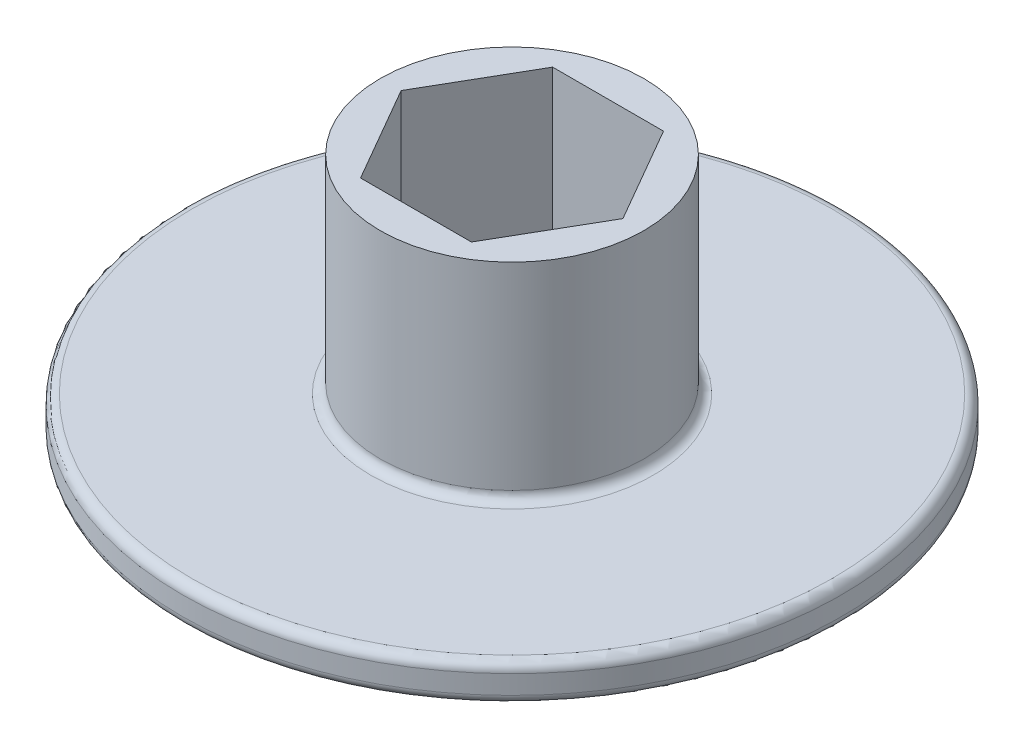
ISO-10303-21;
HEADER;
FILE_DESCRIPTION(('STEP AP214'),'2;1');
FILE_NAME('part.step','',(''),(''),'','','');
FILE_SCHEMA(('AUTOMOTIVE_DESIGN { 1 0 10303 214 1 1 1 1 }'));
ENDSEC;
DATA;
#1=APPLICATION_CONTEXT('core data for automotive mechanical design processes');
#2=APPLICATION_PROTOCOL_DEFINITION('international standard','automotive_design',2000,#1);
#3=PRODUCT_CONTEXT('',#1,'mechanical');
#4=PRODUCT('Part','Part','',(#3));
#5=PRODUCT_RELATED_PRODUCT_CATEGORY('part','',(#4));
#6=PRODUCT_DEFINITION_FORMATION('','',#4);
#7=PRODUCT_DEFINITION_CONTEXT('part definition',#1,'design');
#8=PRODUCT_DEFINITION('design','',#6,#7);
#9=PRODUCT_DEFINITION_SHAPE('','',#8);
#10=(LENGTH_UNIT() NAMED_UNIT(*) SI_UNIT(.MILLI.,.METRE.));
#11=(NAMED_UNIT(*) PLANE_ANGLE_UNIT() SI_UNIT($,.RADIAN.));
#12=(NAMED_UNIT(*) SI_UNIT($,.STERADIAN.) SOLID_ANGLE_UNIT());
#13=UNCERTAINTY_MEASURE_WITH_UNIT(LENGTH_MEASURE(1.E-05),#10,'distance_accuracy_value','');
#14=(GEOMETRIC_REPRESENTATION_CONTEXT(3) GLOBAL_UNCERTAINTY_ASSIGNED_CONTEXT((#13)) GLOBAL_UNIT_ASSIGNED_CONTEXT((#10,
#11,#12)) REPRESENTATION_CONTEXT('',''));
#15=CARTESIAN_POINT('',(0.,0.,0.));
#16=DIRECTION('',(0.,0.,1.));
#17=DIRECTION('',(1.,0.,0.));
#18=AXIS2_PLACEMENT_3D('',#15,#16,#17);
#19=CARTESIAN_POINT('',(0.,2.54,0.));
#20=DIRECTION('',(0.,1.,0.));
#21=DIRECTION('',(0.,0.,1.));
#22=AXIS2_PLACEMENT_3D('',#19,#20,#21);
#23=PLANE('',#22);
#24=CARTESIAN_POINT('',(0.,2.54,0.));
#25=DIRECTION('',(0.,1.,0.));
#26=DIRECTION('',(0.,0.,1.));
#27=AXIS2_PLACEMENT_3D('',#24,#25,#26);
#28=CIRCLE('',#27,9.525);
#29=CARTESIAN_POINT('',(0.,2.54,9.525));
#30=VERTEX_POINT('',#29);
#31=EDGE_CURVE('E180',#30,#30,#28,.F.);
#32=ORIENTED_EDGE('',*,*,#31,.T.);
#33=EDGE_LOOP('',(#32));
#34=FACE_BOUND('',#33,.T.);
#35=CARTESIAN_POINT('',(0.,2.54,0.));
#36=DIRECTION('',(0.,1.,0.));
#37=DIRECTION('',(0.,0.,1.));
#38=AXIS2_PLACEMENT_3D('',#35,#36,#37);
#39=CIRCLE('',#38,21.59);
#40=CARTESIAN_POINT('',(0.,2.54,21.59));
#41=VERTEX_POINT('',#40);
#42=EDGE_CURVE('E176',#41,#41,#39,.T.);
#43=ORIENTED_EDGE('',*,*,#42,.T.);
#44=EDGE_LOOP('',(#43));
#45=FACE_BOUND('',#44,.T.);
#46=ADVANCED_FACE('F42',(#34,#45),#23,.T.);
#47=CARTESIAN_POINT('',(0.,0.,0.));
#48=DIRECTION('',(0.,1.,0.));
#49=DIRECTION('',(0.,0.,1.));
#50=AXIS2_PLACEMENT_3D('',#47,#48,#49);
#51=PLANE('',#50);
#52=DIRECTION('',(0.500000000000007,0.,0.866025403784435));
#53=VECTOR('',#52,1.);
#54=CARTESIAN_POINT('',(-4.28942382494426,0.,6.79450000000004));
#55=LINE('',#54,#53);
#56=CARTESIAN_POINT('',(-8.21223022895324,0.,0.));
#57=VERTEX_POINT('',#56);
#58=CARTESIAN_POINT('',(-4.10611511447655,0.,7.11200000000004));
#59=VERTEX_POINT('',#58);
#60=EDGE_CURVE('E208',#57,#59,#55,.T.);
#61=ORIENTED_EDGE('',*,*,#60,.T.);
#62=DIRECTION('',(1.,0.,0.));
#63=VECTOR('',#62,1.);
#64=CARTESIAN_POINT('',(3.73949769354129,0.,7.11199999999996));
#65=LINE('',#64,#63);
#66=CARTESIAN_POINT('',(4.1061151144767,0.,7.11199999999996));
#67=VERTEX_POINT('',#66);
#68=EDGE_CURVE('E211',#59,#67,#65,.T.);
#69=ORIENTED_EDGE('',*,*,#68,.T.);
#70=DIRECTION('',(0.499999999999995,0.,-0.866025403784442));
#71=VECTOR('',#70,1.);
#72=CARTESIAN_POINT('',(8.02892151848554,0.,0.317499999999996));
#73=LINE('',#72,#71);
#74=CARTESIAN_POINT('',(8.21223022895324,0.,0.));
#75=VERTEX_POINT('',#74);
#76=EDGE_CURVE('E196',#67,#75,#73,.T.);
#77=ORIENTED_EDGE('',*,*,#76,.T.);
#78=DIRECTION('',(-0.500000000000001,0.,-0.866025403784438));
#79=VECTOR('',#78,1.);
#80=CARTESIAN_POINT('',(4.28942382494431,0.,-6.79450000000002));
#81=LINE('',#80,#79);
#82=CARTESIAN_POINT('',(4.10611511447661,0.,-7.11200000000002));
#83=VERTEX_POINT('',#82);
#84=EDGE_CURVE('E199',#75,#83,#81,.T.);
#85=ORIENTED_EDGE('',*,*,#84,.T.);
#86=DIRECTION('',(-1.,0.,0.));
#87=VECTOR('',#86,1.);
#88=CARTESIAN_POINT('',(-3.73949769354124,0.,-7.11199999999999));
#89=LINE('',#88,#87);
#90=CARTESIAN_POINT('',(-4.10611511447665,0.,-7.11199999999999));
#91=VERTEX_POINT('',#90);
#92=EDGE_CURVE('E202',#83,#91,#89,.T.);
#93=ORIENTED_EDGE('',*,*,#92,.T.);
#94=DIRECTION('',(-0.499999999999995,0.,0.866025403784442));
#95=VECTOR('',#94,1.);
#96=CARTESIAN_POINT('',(-8.02892151848554,0.,-0.317499999999944));
#97=LINE('',#96,#95);
#98=EDGE_CURVE('E205',#91,#57,#97,.T.);
#99=ORIENTED_EDGE('',*,*,#98,.T.);
#100=EDGE_LOOP('',(#61,#69,#77,#85,#93,#99));
#101=FACE_BOUND('',#100,.T.);
#102=CARTESIAN_POINT('',(0.,0.,0.));
#103=DIRECTION('',(0.,1.,0.));
#104=DIRECTION('',(0.,0.,1.));
#105=AXIS2_PLACEMENT_3D('',#102,#103,#104);
#106=CIRCLE('',#105,21.59);
#107=CARTESIAN_POINT('',(0.,0.,21.59));
#108=VERTEX_POINT('',#107);
#109=EDGE_CURVE('E192',#108,#108,#106,.F.);
#110=ORIENTED_EDGE('',*,*,#109,.T.);
#111=EDGE_LOOP('',(#110));
#112=FACE_BOUND('',#111,.T.);
#113=ADVANCED_FACE('F292',(#101,#112),#51,.F.);
#114=CARTESIAN_POINT('',(0.,2.54,0.));
#115=DIRECTION('',(0.,-1.,0.));
#116=DIRECTION('',(0.,0.,-1.));
#117=AXIS2_PLACEMENT_3D('',#114,#115,#116);
#118=CYLINDRICAL_SURFACE('',#117,22.225);
#119=CARTESIAN_POINT('',(0.,1.905,0.));
#120=DIRECTION('',(0.,1.,0.));
#121=DIRECTION('',(0.,0.,1.));
#122=AXIS2_PLACEMENT_3D('',#119,#120,#121);
#123=CIRCLE('',#122,22.225);
#124=CARTESIAN_POINT('',(0.,1.905,22.225));
#125=VERTEX_POINT('',#124);
#126=EDGE_CURVE('E188',#125,#125,#123,.F.);
#127=ORIENTED_EDGE('',*,*,#126,.T.);
#128=EDGE_LOOP('',(#127));
#129=FACE_BOUND('',#128,.T.);
#130=CARTESIAN_POINT('',(0.,0.635,0.));
#131=DIRECTION('',(0.,1.,0.));
#132=DIRECTION('',(0.,0.,1.));
#133=AXIS2_PLACEMENT_3D('',#130,#131,#132);
#134=CIRCLE('',#133,22.225);
#135=CARTESIAN_POINT('',(0.,0.635,22.225));
#136=VERTEX_POINT('',#135);
#137=EDGE_CURVE('E184',#136,#136,#134,.T.);
#138=ORIENTED_EDGE('',*,*,#137,.T.);
#139=EDGE_LOOP('',(#138));
#140=FACE_BOUND('',#139,.T.);
#141=ADVANCED_FACE('F298',(#129,#140),#118,.T.);
#142=CARTESIAN_POINT('',(3.73949769354128,2.54,6.47699999999996));
#143=DIRECTION('',(-0.866025403784442,0.,-0.499999999999995));
#144=DIRECTION('',(-0.499999999999995,0.,0.866025403784442));
#145=AXIS2_PLACEMENT_3D('',#142,#143,#144);
#146=PLANE('',#145);
#147=DIRECTION('',(0.,-1.,0.));
#148=VECTOR('',#147,1.);
#149=CARTESIAN_POINT('',(7.47899538708242,2.54,0.));
#150=LINE('',#149,#148);
#151=CARTESIAN_POINT('',(7.47899538708242,16.51,-1.04083408558608E-13));
#152=VERTEX_POINT('',#151);
#153=CARTESIAN_POINT('',(7.47899538708242,0.635,0.));
#154=VERTEX_POINT('',#153);
#155=EDGE_CURVE('E121',#152,#154,#150,.T.);
#156=ORIENTED_EDGE('',*,*,#155,.T.);
#157=DIRECTION('',(0.499999999999995,0.,-0.866025403784442));
#158=VECTOR('',#157,1.);
#159=CARTESIAN_POINT('',(3.73949769354128,0.635,6.47699999999996));
#160=LINE('',#159,#158);
#161=CARTESIAN_POINT('',(3.73949769354128,0.635,6.47699999999996));
#162=VERTEX_POINT('',#161);
#163=EDGE_CURVE('E11',#154,#162,#160,.F.);
#164=ORIENTED_EDGE('',*,*,#163,.T.);
#165=DIRECTION('',(0.,-1.,0.));
#166=VECTOR('',#165,1.);
#167=CARTESIAN_POINT('',(3.73949769354128,2.54,6.47699999999996));
#168=LINE('',#167,#166);
#169=CARTESIAN_POINT('',(3.73949769354128,16.51,6.47699999999996));
#170=VERTEX_POINT('',#169);
#171=EDGE_CURVE('E156',#170,#162,#168,.T.);
#172=ORIENTED_EDGE('',*,*,#171,.F.);
#173=DIRECTION('',(0.499999999999989,0.,-0.866025403784445));
#174=VECTOR('',#173,1.);
#175=CARTESIAN_POINT('',(3.73949769354128,16.51,6.47699999999996));
#176=LINE('',#175,#174);
#177=EDGE_CURVE('E149',#170,#152,#176,.T.);
#178=ORIENTED_EDGE('',*,*,#177,.T.);
#179=EDGE_LOOP('',(#156,#164,#172,#178));
#180=FACE_BOUND('',#179,.T.);
#181=ADVANCED_FACE('F266',(#180),#146,.T.);
#182=CARTESIAN_POINT('',(7.47899538708242,2.54,0.));
#183=DIRECTION('',(-0.866025403784438,0.,0.500000000000001));
#184=DIRECTION('',(0.500000000000001,0.,0.866025403784438));
#185=AXIS2_PLACEMENT_3D('',#182,#183,#184);
#186=PLANE('',#185);
#187=DIRECTION('',(0.,-1.,0.));
#188=VECTOR('',#187,1.);
#189=CARTESIAN_POINT('',(3.73949769354119,2.54,-6.47700000000001));
#190=LINE('',#189,#188);
#191=CARTESIAN_POINT('',(3.73949769354119,16.51,-6.47700000000001));
#192=VERTEX_POINT('',#191);
#193=CARTESIAN_POINT('',(3.73949769354119,0.635,-6.47700000000001));
#194=VERTEX_POINT('',#193);
#195=EDGE_CURVE('E113',#192,#194,#190,.T.);
#196=ORIENTED_EDGE('',*,*,#195,.T.);
#197=DIRECTION('',(-0.500000000000001,0.,-0.866025403784438));
#198=VECTOR('',#197,1.);
#199=CARTESIAN_POINT('',(7.47899538708242,0.635,0.));
#200=LINE('',#199,#198);
#201=EDGE_CURVE('E52',#194,#154,#200,.F.);
#202=ORIENTED_EDGE('',*,*,#201,.T.);
#203=ORIENTED_EDGE('',*,*,#155,.F.);
#204=DIRECTION('',(-0.500000000000007,0.,-0.866025403784434));
#205=VECTOR('',#204,1.);
#206=CARTESIAN_POINT('',(7.47899538708242,16.51,-1.04083408558608E-13));
#207=LINE('',#206,#205);
#208=EDGE_CURVE('E125',#152,#192,#207,.T.);
#209=ORIENTED_EDGE('',*,*,#208,.T.);
#210=EDGE_LOOP('',(#196,#202,#203,#209));
#211=FACE_BOUND('',#210,.T.);
#212=ADVANCED_FACE('F126',(#211),#186,.T.);
#213=CARTESIAN_POINT('',(3.73949769354119,2.54,-6.47700000000001));
#214=DIRECTION('',(0.,0.,1.));
#215=DIRECTION('',(1.,0.,0.));
#216=AXIS2_PLACEMENT_3D('',#213,#214,#215);
#217=PLANE('',#216);
#218=DIRECTION('',(0.,-1.,0.));
#219=VECTOR('',#218,1.);
#220=CARTESIAN_POINT('',(-3.73949769354124,2.54,-6.47699999999999));
#221=LINE('',#220,#219);
#222=CARTESIAN_POINT('',(-3.73949769354124,16.51,-6.47699999999999));
#223=VERTEX_POINT('',#222);
#224=CARTESIAN_POINT('',(-3.73949769354124,0.635,-6.47699999999999));
#225=VERTEX_POINT('',#224);
#226=EDGE_CURVE('E122',#223,#225,#221,.T.);
#227=ORIENTED_EDGE('',*,*,#226,.T.);
#228=DIRECTION('',(-1.,0.,0.));
#229=VECTOR('',#228,1.);
#230=CARTESIAN_POINT('',(3.73949769354119,0.635,-6.47700000000001));
#231=LINE('',#230,#229);
#232=EDGE_CURVE('E67',#225,#194,#231,.F.);
#233=ORIENTED_EDGE('',*,*,#232,.T.);
#234=ORIENTED_EDGE('',*,*,#195,.F.);
#235=DIRECTION('',(-1.,0.,0.));
#236=VECTOR('',#235,1.);
#237=CARTESIAN_POINT('',(3.73949769354119,16.51,-6.47700000000001));
#238=LINE('',#237,#236);
#239=EDGE_CURVE('E117',#192,#223,#238,.T.);
#240=ORIENTED_EDGE('',*,*,#239,.T.);
#241=EDGE_LOOP('',(#227,#233,#234,#240));
#242=FACE_BOUND('',#241,.T.);
#243=ADVANCED_FACE('F115',(#242),#217,.T.);
#244=CARTESIAN_POINT('',(-3.73949769354124,2.54,-6.47699999999999));
#245=DIRECTION('',(0.866025403784441,0.,0.499999999999995));
#246=DIRECTION('',(0.499999999999995,0.,-0.866025403784442));
#247=AXIS2_PLACEMENT_3D('',#244,#245,#246);
#248=PLANE('',#247);
#249=DIRECTION('',(0.,-1.,0.));
#250=VECTOR('',#249,1.);
#251=CARTESIAN_POINT('',(-7.47899538708242,2.54,0.));
#252=LINE('',#251,#250);
#253=CARTESIAN_POINT('',(-7.47899538708242,16.51,0.));
#254=VERTEX_POINT('',#253);
#255=CARTESIAN_POINT('',(-7.47899538708242,0.635,0.));
#256=VERTEX_POINT('',#255);
#257=EDGE_CURVE('E164',#254,#256,#252,.T.);
#258=ORIENTED_EDGE('',*,*,#257,.T.);
#259=DIRECTION('',(-0.499999999999995,0.,0.866025403784442));
#260=VECTOR('',#259,1.);
#261=CARTESIAN_POINT('',(-3.73949769354124,0.635,-6.47699999999999));
#262=LINE('',#261,#260);
#263=EDGE_CURVE('E222',#256,#225,#262,.F.);
#264=ORIENTED_EDGE('',*,*,#263,.T.);
#265=ORIENTED_EDGE('',*,*,#226,.F.);
#266=DIRECTION('',(-0.499999999999995,0.,0.866025403784441));
#267=VECTOR('',#266,1.);
#268=CARTESIAN_POINT('',(-3.73949769354124,16.51,-6.47699999999999));
#269=LINE('',#268,#267);
#270=EDGE_CURVE('E135',#223,#254,#269,.T.);
#271=ORIENTED_EDGE('',*,*,#270,.T.);
#272=EDGE_LOOP('',(#258,#264,#265,#271));
#273=FACE_BOUND('',#272,.T.);
#274=ADVANCED_FACE('F282',(#273),#248,.T.);
#275=CARTESIAN_POINT('',(-7.47899538708242,2.54,0.));
#276=DIRECTION('',(0.866025403784434,0.,-0.500000000000007));
#277=DIRECTION('',(-0.500000000000007,0.,-0.866025403784435));
#278=AXIS2_PLACEMENT_3D('',#275,#276,#277);
#279=PLANE('',#278);
#280=DIRECTION('',(0.,-1.,0.));
#281=VECTOR('',#280,1.);
#282=CARTESIAN_POINT('',(-3.73949769354115,2.54,6.47700000000004));
#283=LINE('',#282,#281);
#284=CARTESIAN_POINT('',(-3.73949769354115,16.51,6.47700000000004));
#285=VERTEX_POINT('',#284);
#286=CARTESIAN_POINT('',(-3.73949769354115,0.635,6.47700000000004));
#287=VERTEX_POINT('',#286);
#288=EDGE_CURVE('E160',#285,#287,#283,.T.);
#289=ORIENTED_EDGE('',*,*,#288,.T.);
#290=DIRECTION('',(0.500000000000007,0.,0.866025403784435));
#291=VECTOR('',#290,1.);
#292=CARTESIAN_POINT('',(-7.47899538708242,0.635,0.));
#293=LINE('',#292,#291);
#294=EDGE_CURVE('E219',#287,#256,#293,.F.);
#295=ORIENTED_EDGE('',*,*,#294,.T.);
#296=ORIENTED_EDGE('',*,*,#257,.F.);
#297=DIRECTION('',(0.500000000000007,0.,0.866025403784435));
#298=VECTOR('',#297,1.);
#299=CARTESIAN_POINT('',(-7.47899538708242,16.51,0.));
#300=LINE('',#299,#298);
#301=EDGE_CURVE('E139',#254,#285,#300,.T.);
#302=ORIENTED_EDGE('',*,*,#301,.T.);
#303=EDGE_LOOP('',(#289,#295,#296,#302));
#304=FACE_BOUND('',#303,.T.);
#305=ADVANCED_FACE('F280',(#304),#279,.T.);
#306=CARTESIAN_POINT('',(-3.73949769354115,2.54,6.47700000000004));
#307=DIRECTION('',(0.,0.,-1.));
#308=DIRECTION('',(-1.,0.,0.));
#309=AXIS2_PLACEMENT_3D('',#306,#307,#308);
#310=PLANE('',#309);
#311=ORIENTED_EDGE('',*,*,#171,.T.);
#312=DIRECTION('',(1.,0.,0.));
#313=VECTOR('',#312,1.);
#314=CARTESIAN_POINT('',(-3.73949769354115,0.635,6.47700000000004));
#315=LINE('',#314,#313);
#316=EDGE_CURVE('E215',#162,#287,#315,.F.);
#317=ORIENTED_EDGE('',*,*,#316,.T.);
#318=ORIENTED_EDGE('',*,*,#288,.F.);
#319=DIRECTION('',(1.,0.,0.));
#320=VECTOR('',#319,1.);
#321=CARTESIAN_POINT('',(-3.73949769354115,16.51,6.47700000000004));
#322=LINE('',#321,#320);
#323=EDGE_CURVE('E145',#285,#170,#322,.T.);
#324=ORIENTED_EDGE('',*,*,#323,.T.);
#325=EDGE_LOOP('',(#311,#317,#318,#324));
#326=FACE_BOUND('',#325,.T.);
#327=ADVANCED_FACE('F269',(#326),#310,.T.);
#328=CARTESIAN_POINT('',(0.,16.51,0.));
#329=DIRECTION('',(0.,1.,0.));
#330=DIRECTION('',(0.,0.,1.));
#331=AXIS2_PLACEMENT_3D('',#328,#329,#330);
#332=PLANE('',#331);
#333=CARTESIAN_POINT('',(0.,16.51,0.));
#334=DIRECTION('',(0.,1.,0.));
#335=DIRECTION('',(0.,0.,1.));
#336=AXIS2_PLACEMENT_3D('',#333,#334,#335);
#337=CIRCLE('',#336,8.89);
#338=CARTESIAN_POINT('',(0.,16.51,8.89));
#339=VERTEX_POINT('',#338);
#340=EDGE_CURVE('E152',#339,#339,#337,.T.);
#341=ORIENTED_EDGE('',*,*,#340,.T.);
#342=EDGE_LOOP('',(#341));
#343=FACE_BOUND('',#342,.T.);
#344=ORIENTED_EDGE('',*,*,#239,.F.);
#345=ORIENTED_EDGE('',*,*,#208,.F.);
#346=ORIENTED_EDGE('',*,*,#177,.F.);
#347=ORIENTED_EDGE('',*,*,#323,.F.);
#348=ORIENTED_EDGE('',*,*,#301,.F.);
#349=ORIENTED_EDGE('',*,*,#270,.F.);
#350=EDGE_LOOP('',(#344,#345,#346,#347,#348,#349));
#351=FACE_BOUND('',#350,.T.);
#352=ADVANCED_FACE('F132',(#343,#351),#332,.T.);
#353=CARTESIAN_POINT('',(0.,16.51,0.));
#354=DIRECTION('',(0.,-1.,0.));
#355=DIRECTION('',(0.,0.,-1.));
#356=AXIS2_PLACEMENT_3D('',#353,#354,#355);
#357=CYLINDRICAL_SURFACE('',#356,8.89);
#358=CARTESIAN_POINT('',(0.,3.175,0.));
#359=DIRECTION('',(0.,1.,0.));
#360=DIRECTION('',(0.,0.,1.));
#361=AXIS2_PLACEMENT_3D('',#358,#359,#360);
#362=CIRCLE('',#361,8.89);
#363=CARTESIAN_POINT('',(0.,3.175,8.89));
#364=VERTEX_POINT('',#363);
#365=EDGE_CURVE('E172',#364,#364,#362,.T.);
#366=ORIENTED_EDGE('',*,*,#365,.T.);
#367=EDGE_LOOP('',(#366));
#368=FACE_BOUND('',#367,.T.);
#369=ORIENTED_EDGE('',*,*,#340,.F.);
#370=EDGE_LOOP('',(#369));
#371=FACE_BOUND('',#370,.T.);
#372=ADVANCED_FACE('F312',(#368,#371),#357,.T.);
#373=CARTESIAN_POINT('',(0.,3.175,0.));
#374=DIRECTION('',(0.,1.,0.));
#375=DIRECTION('',(0.,0.,1.));
#376=AXIS2_PLACEMENT_3D('',#373,#374,#375);
#377=TOROIDAL_SURFACE('',#376,9.525,0.635);
#378=ORIENTED_EDGE('',*,*,#31,.F.);
#379=EDGE_LOOP('',(#378));
#380=FACE_BOUND('',#379,.T.);
#381=ORIENTED_EDGE('',*,*,#365,.F.);
#382=EDGE_LOOP('',(#381));
#383=FACE_BOUND('',#382,.T.);
#384=ADVANCED_FACE('F308',(#380,#383),#377,.F.);
#385=CARTESIAN_POINT('',(0.,1.905,0.));
#386=DIRECTION('',(0.,1.,0.));
#387=DIRECTION('',(0.,0.,1.));
#388=AXIS2_PLACEMENT_3D('',#385,#386,#387);
#389=TOROIDAL_SURFACE('',#388,21.59,0.635);
#390=ORIENTED_EDGE('',*,*,#126,.F.);
#391=EDGE_LOOP('',(#390));
#392=FACE_BOUND('',#391,.T.);
#393=ORIENTED_EDGE('',*,*,#42,.F.);
#394=EDGE_LOOP('',(#393));
#395=FACE_BOUND('',#394,.T.);
#396=ADVANCED_FACE('F311',(#392,#395),#389,.T.);
#397=CARTESIAN_POINT('',(0.,0.635,-7.112));
#398=DIRECTION('',(1.,0.,0.));
#399=DIRECTION('',(0.,0.,-1.));
#400=AXIS2_PLACEMENT_3D('',#397,#398,#399);
#401=CYLINDRICAL_SURFACE('',#400,0.635);
#402=CARTESIAN_POINT('',(4.10611511447661,0.635,-7.11200000000002));
#403=DIRECTION('',(0.86602540378444,0.,0.499999999999998));
#404=DIRECTION('',(0.499999999999998,0.,-0.86602540378444));
#405=AXIS2_PLACEMENT_3D('',#402,#403,#404);
#406=ELLIPSE('',#405,0.733234841870825,0.635);
#407=EDGE_CURVE('E242',#194,#83,#406,.T.);
#408=ORIENTED_EDGE('',*,*,#407,.F.);
#409=ORIENTED_EDGE('',*,*,#232,.F.);
#410=CARTESIAN_POINT('',(-4.10611511447665,0.635,-7.11199999999999));
#411=DIRECTION('',(0.866025403784436,0.,-0.500000000000004));
#412=DIRECTION('',(-0.500000000000004,0.,-0.866025403784436));
#413=AXIS2_PLACEMENT_3D('',#410,#411,#412);
#414=ELLIPSE('',#413,0.733234841870825,0.635);
#415=EDGE_CURVE('E46',#91,#225,#414,.F.);
#416=ORIENTED_EDGE('',*,*,#415,.F.);
#417=ORIENTED_EDGE('',*,*,#92,.F.);
#418=EDGE_LOOP('',(#408,#409,#416,#417));
#419=FACE_BOUND('',#418,.T.);
#420=ADVANCED_FACE('F257',(#419),#401,.T.);
#421=CARTESIAN_POINT('',(-6.15917267171495,0.635,-3.55599999999996));
#422=DIRECTION('',(0.499999999999995,0.,-0.866025403784442));
#423=DIRECTION('',(-0.866025403784441,0.,-0.499999999999995));
#424=AXIS2_PLACEMENT_3D('',#421,#422,#423);
#425=CYLINDRICAL_SURFACE('',#424,0.635);
#426=ORIENTED_EDGE('',*,*,#415,.T.);
#427=ORIENTED_EDGE('',*,*,#263,.F.);
#428=CARTESIAN_POINT('',(-8.21223022895324,0.635,0.));
#429=DIRECTION('',(0.,0.,-1.));
#430=DIRECTION('',(-1.,0.,0.));
#431=AXIS2_PLACEMENT_3D('',#428,#429,#430);
#432=ELLIPSE('',#431,0.733234841870825,0.635);
#433=EDGE_CURVE('E239',#57,#256,#432,.F.);
#434=ORIENTED_EDGE('',*,*,#433,.F.);
#435=ORIENTED_EDGE('',*,*,#98,.F.);
#436=EDGE_LOOP('',(#426,#427,#434,#435));
#437=FACE_BOUND('',#436,.T.);
#438=ADVANCED_FACE('F253',(#437),#425,.T.);
#439=CARTESIAN_POINT('',(6.15917267171493,0.635,-3.55600000000001));
#440=DIRECTION('',(0.500000000000001,0.,0.866025403784438));
#441=DIRECTION('',(0.866025403784438,0.,-0.500000000000001));
#442=AXIS2_PLACEMENT_3D('',#439,#440,#441);
#443=CYLINDRICAL_SURFACE('',#442,0.635);
#444=ORIENTED_EDGE('',*,*,#407,.T.);
#445=ORIENTED_EDGE('',*,*,#84,.F.);
#446=CARTESIAN_POINT('',(8.21223022895324,0.635,0.));
#447=DIRECTION('',(0.,0.,1.));
#448=DIRECTION('',(1.,0.,0.));
#449=AXIS2_PLACEMENT_3D('',#446,#447,#448);
#450=ELLIPSE('',#449,0.733234841870824,0.635);
#451=EDGE_CURVE('E235',#154,#75,#450,.T.);
#452=ORIENTED_EDGE('',*,*,#451,.F.);
#453=ORIENTED_EDGE('',*,*,#201,.F.);
#454=EDGE_LOOP('',(#444,#445,#452,#453));
#455=FACE_BOUND('',#454,.T.);
#456=ADVANCED_FACE('F259',(#455),#443,.T.);
#457=CARTESIAN_POINT('',(-6.1591726717149,0.635,3.55600000000005));
#458=DIRECTION('',(-0.500000000000007,0.,-0.866025403784435));
#459=DIRECTION('',(-0.866025403784434,0.,0.500000000000007));
#460=AXIS2_PLACEMENT_3D('',#457,#458,#459);
#461=CYLINDRICAL_SURFACE('',#460,0.635);
#462=ORIENTED_EDGE('',*,*,#433,.T.);
#463=ORIENTED_EDGE('',*,*,#294,.F.);
#464=CARTESIAN_POINT('',(-4.10611511447655,0.635,7.11200000000004));
#465=DIRECTION('',(-0.866025403784443,0.,-0.499999999999992));
#466=DIRECTION('',(-0.499999999999992,0.,0.866025403784443));
#467=AXIS2_PLACEMENT_3D('',#464,#465,#466);
#468=ELLIPSE('',#467,0.733234841870825,0.635);
#469=EDGE_CURVE('E232',#59,#287,#468,.F.);
#470=ORIENTED_EDGE('',*,*,#469,.F.);
#471=ORIENTED_EDGE('',*,*,#60,.F.);
#472=EDGE_LOOP('',(#462,#463,#470,#471));
#473=FACE_BOUND('',#472,.T.);
#474=ADVANCED_FACE('F278',(#473),#461,.T.);
#475=CARTESIAN_POINT('',(6.15917267171497,0.635,3.55599999999998));
#476=DIRECTION('',(-0.499999999999995,0.,0.866025403784442));
#477=DIRECTION('',(0.866025403784442,0.,0.499999999999995));
#478=AXIS2_PLACEMENT_3D('',#475,#476,#477);
#479=CYLINDRICAL_SURFACE('',#478,0.635);
#480=ORIENTED_EDGE('',*,*,#451,.T.);
#481=ORIENTED_EDGE('',*,*,#76,.F.);
#482=CARTESIAN_POINT('',(4.1061151144767,0.635,7.11199999999996));
#483=DIRECTION('',(-0.866025403784435,0.,0.500000000000007));
#484=DIRECTION('',(-0.500000000000007,0.,-0.866025403784435));
#485=AXIS2_PLACEMENT_3D('',#482,#483,#484);
#486=ELLIPSE('',#485,0.733234841870824,0.635);
#487=EDGE_CURVE('E229',#162,#67,#486,.T.);
#488=ORIENTED_EDGE('',*,*,#487,.F.);
#489=ORIENTED_EDGE('',*,*,#163,.F.);
#490=EDGE_LOOP('',(#480,#481,#488,#489));
#491=FACE_BOUND('',#490,.T.);
#492=ADVANCED_FACE('F264',(#491),#479,.T.);
#493=CARTESIAN_POINT('',(0.,0.635,7.112));
#494=DIRECTION('',(-1.,0.,0.));
#495=DIRECTION('',(0.,0.,1.));
#496=AXIS2_PLACEMENT_3D('',#493,#494,#495);
#497=CYLINDRICAL_SURFACE('',#496,0.635);
#498=ORIENTED_EDGE('',*,*,#469,.T.);
#499=ORIENTED_EDGE('',*,*,#316,.F.);
#500=ORIENTED_EDGE('',*,*,#487,.T.);
#501=ORIENTED_EDGE('',*,*,#68,.F.);
#502=EDGE_LOOP('',(#498,#499,#500,#501));
#503=FACE_BOUND('',#502,.T.);
#504=ADVANCED_FACE('F272',(#503),#497,.T.);
#505=CARTESIAN_POINT('',(0.,0.635,0.));
#506=DIRECTION('',(0.,1.,0.));
#507=DIRECTION('',(0.,0.,1.));
#508=AXIS2_PLACEMENT_3D('',#505,#506,#507);
#509=TOROIDAL_SURFACE('',#508,21.59,0.635);
#510=ORIENTED_EDGE('',*,*,#109,.F.);
#511=EDGE_LOOP('',(#510));
#512=FACE_BOUND('',#511,.T.);
#513=ORIENTED_EDGE('',*,*,#137,.F.);
#514=EDGE_LOOP('',(#513));
#515=FACE_BOUND('',#514,.T.);
#516=ADVANCED_FACE('F44',(#512,#515),#509,.T.);
#517=CLOSED_SHELL('',(#46,#113,#141,#181,#212,#243,#274,#305,#327,#352,#372,#384,#396,#420,#438,
#456,#474,#492,#504,#516));
#518=MANIFOLD_SOLID_BREP('B2',#517);
#519=ADVANCED_BREP_SHAPE_REPRESENTATION('',(#18,#518),#14);
#520=SHAPE_DEFINITION_REPRESENTATION(#9,#519);
ENDSEC;
END-ISO-10303-21;
